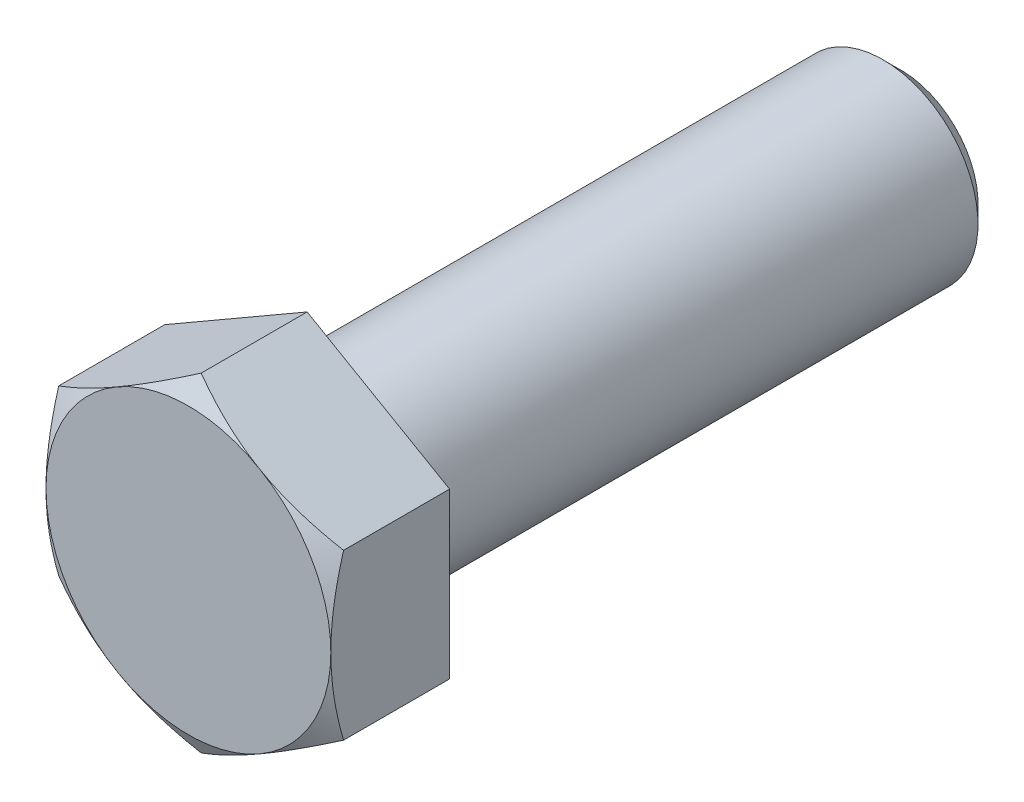
ISO-10303-21;
HEADER;
FILE_DESCRIPTION(('STEP AP214'),'2;1');
FILE_NAME('part.step','',(''),(''),'','','');
FILE_SCHEMA(('AUTOMOTIVE_DESIGN { 1 0 10303 214 1 1 1 1 }'));
ENDSEC;
DATA;
#1=APPLICATION_CONTEXT('core data for automotive mechanical design processes');
#2=APPLICATION_PROTOCOL_DEFINITION('international standard','automotive_design',2000,#1);
#3=PRODUCT_CONTEXT('',#1,'mechanical');
#4=PRODUCT('Part','Part','',(#3));
#5=PRODUCT_RELATED_PRODUCT_CATEGORY('part','',(#4));
#6=PRODUCT_DEFINITION_FORMATION('','',#4);
#7=PRODUCT_DEFINITION_CONTEXT('part definition',#1,'design');
#8=PRODUCT_DEFINITION('design','',#6,#7);
#9=PRODUCT_DEFINITION_SHAPE('','',#8);
#10=(LENGTH_UNIT() NAMED_UNIT(*) SI_UNIT(.MILLI.,.METRE.));
#11=(NAMED_UNIT(*) PLANE_ANGLE_UNIT() SI_UNIT($,.RADIAN.));
#12=(NAMED_UNIT(*) SI_UNIT($,.STERADIAN.) SOLID_ANGLE_UNIT());
#13=UNCERTAINTY_MEASURE_WITH_UNIT(LENGTH_MEASURE(1.E-05),#10,'distance_accuracy_value','');
#14=(GEOMETRIC_REPRESENTATION_CONTEXT(3) GLOBAL_UNCERTAINTY_ASSIGNED_CONTEXT((#13)) GLOBAL_UNIT_ASSIGNED_CONTEXT((#10,
#11,#12)) REPRESENTATION_CONTEXT('',''));
#15=CARTESIAN_POINT('',(0.,0.,0.));
#16=DIRECTION('',(0.,0.,1.));
#17=DIRECTION('',(1.,0.,0.));
#18=AXIS2_PLACEMENT_3D('',#15,#16,#17);
#19=CARTESIAN_POINT('',(-11.9944518424145,-6.925,10.));
#20=DIRECTION('',(1.,0.,0.));
#21=DIRECTION('',(0.,0.,-1.));
#22=AXIS2_PLACEMENT_3D('',#19,#20,#21);
#23=PLANE('',#22);
#24=CARTESIAN_POINT('',(-11.9944518424145,-18.916651266714,3.99304255411589));
#25=CARTESIAN_POINT('',(-11.9944518424145,-18.65332713006,4.12143548843301));
#26=CARTESIAN_POINT('',(-11.9944518424145,-18.389702350382,4.24921154158444));
#27=CARTESIAN_POINT('',(-11.9944518424145,-17.8617888659462,4.50339074864758));
#28=CARTESIAN_POINT('',(-11.9944518424145,-17.5975001549837,4.62979388966999));
#29=CARTESIAN_POINT('',(-11.9944518424145,-16.8034779537679,5.00676659385936));
#30=CARTESIAN_POINT('',(-11.9944518424145,-16.2726616224978,5.2550636391158));
#31=CARTESIAN_POINT('',(-11.9944518424145,-15.2048398758484,5.74542434972928));
#32=CARTESIAN_POINT('',(-11.9944518424145,-14.6678166677863,5.98744935838821));
#33=CARTESIAN_POINT('',(-11.9944518424145,-13.5896076882344,6.4620091280023));
#34=CARTESIAN_POINT('',(-11.9944518424145,-13.0484221060183,6.6945443174863));
#35=CARTESIAN_POINT('',(-11.9944518424145,-11.9425225437582,7.15533366556413));
#36=CARTESIAN_POINT('',(-11.9944518424145,-11.3776347187372,7.38317268715597));
#37=CARTESIAN_POINT('',(-11.9944518424145,-10.2413641664025,7.82235885007694));
#38=CARTESIAN_POINT('',(-11.9944518424145,-9.66998073584953,8.03370418587515));
#39=CARTESIAN_POINT('',(-11.9944518424145,-8.52079847130679,8.43458178671426));
#40=CARTESIAN_POINT('',(-11.9944518424145,-7.94301423875377,8.624155586084));
#41=CARTESIAN_POINT('',(-11.9944518424145,-6.77911094521876,8.97562934069589));
#42=CARTESIAN_POINT('',(-11.9944518424145,-6.19299446892464,9.13753768334616));
#43=CARTESIAN_POINT('',(-11.9944518424145,-5.3090468338312,9.35351366164219));
#44=CARTESIAN_POINT('',(-11.9944518424145,-5.0144451577008,9.4208710848185));
#45=CARTESIAN_POINT('',(-11.9944518424145,-4.42317281629482,9.54584821699384));
#46=CARTESIAN_POINT('',(-11.9944518424145,-4.1265021902937,9.60346811031743));
#47=CARTESIAN_POINT('',(-11.9944518424145,-3.53127483954429,9.70797339971101));
#48=CARTESIAN_POINT('',(-11.9944518424145,-3.23271816525139,9.75485908170252));
#49=CARTESIAN_POINT('',(-11.9944518424145,-2.63400739277033,9.83697403318312));
#50=CARTESIAN_POINT('',(-11.9944518424145,-2.33385336052829,9.872203780146));
#51=CARTESIAN_POINT('',(-11.9944518424145,-1.73642378819876,9.92984690973285));
#52=CARTESIAN_POINT('',(-11.9944518424145,-1.43916451574048,9.95242785114576));
#53=CARTESIAN_POINT('',(-11.9944518424145,-0.843956919887871,9.98498619836202));
#54=CARTESIAN_POINT('',(-11.9944518424145,-0.546008608519027,9.99496382248709));
#55=CARTESIAN_POINT('',(-11.9944518424145,0.0500459123668967,10.0020764577051));
#56=CARTESIAN_POINT('',(-11.9944518424145,0.348152122753596,9.99921139731682));
#57=CARTESIAN_POINT('',(-11.9944518424145,0.943971065504697,9.9807119106433));
#58=CARTESIAN_POINT('',(-11.9944518424145,1.2416837798554,9.96507691875408));
#59=CARTESIAN_POINT('',(-11.9944518424145,1.94772756604726,9.91319318370986));
#60=CARTESIAN_POINT('',(-11.9944518424145,2.35566152514817,9.87141191806672));
#61=CARTESIAN_POINT('',(-11.9944518424145,3.16868715491053,9.76608269309507));
#62=CARTESIAN_POINT('',(-11.9944518424145,3.57377846766142,9.70253204129374));
#63=CARTESIAN_POINT('',(-11.9944518424145,4.78420967870067,9.48258089577494));
#64=CARTESIAN_POINT('',(-11.9944518424145,5.58431237319598,9.29691419933176));
#65=CARTESIAN_POINT('',(-11.9944518424145,6.78136342925836,8.97252727686723));
#66=CARTESIAN_POINT('',(-11.9944518424145,7.18444998983348,8.85513442526049));
#67=CARTESIAN_POINT('',(-11.9944518424145,7.98671422467023,8.60755622042891));
#68=CARTESIAN_POINT('',(-11.9944518424145,8.38589186846454,8.47737076758166));
#69=CARTESIAN_POINT('',(-11.9944518424145,9.180455481968,8.20634387181171));
#70=CARTESIAN_POINT('',(-11.9944518424145,9.57584246701539,8.06550537758822));
#71=CARTESIAN_POINT('',(-11.9944518424145,10.3633011529136,7.77489580880496));
#72=CARTESIAN_POINT('',(-11.9944518424145,10.7553729319294,7.62512494552452));
#73=CARTESIAN_POINT('',(-11.9944518424145,11.4819085933445,7.33958466234801));
#74=CARTESIAN_POINT('',(-11.9944518424145,11.8167566455457,7.204788583371));
#75=CARTESIAN_POINT('',(-11.9944518424145,12.484495230893,6.93042557144577));
#76=CARTESIAN_POINT('',(-11.9944518424145,12.81738573167,6.7908585598661));
#77=CARTESIAN_POINT('',(-11.9944518424145,13.8134888316028,6.36598374947554));
#78=CARTESIAN_POINT('',(-11.9944518424145,14.4740786475998,6.07452379938785));
#79=CARTESIAN_POINT('',(-11.9944518424145,15.7899072378391,5.47916602793452));
#80=CARTESIAN_POINT('',(-11.9944518424145,16.4451437864388,5.17526332056267));
#81=CARTESIAN_POINT('',(-11.9944518424145,17.7511030808341,4.55800113610588));
#82=CARTESIAN_POINT('',(-11.9944518424145,18.4018260159929,4.24464205873949));
#83=CARTESIAN_POINT('',(-11.9944518424145,19.7007256439382,3.61002539205532));
#84=CARTESIAN_POINT('',(-11.9944518424145,20.3488963895518,3.28875566096677));
#85=CARTESIAN_POINT('',(-11.9944518424145,21.642301806296,2.64035475241919));
#86=CARTESIAN_POINT('',(-11.9944518424145,22.2875364519682,2.31322352425692));
#87=CARTESIAN_POINT('',(-11.9944518424145,23.5754524501937,1.65433318539717));
#88=CARTESIAN_POINT('',(-11.9944518424145,24.2181343441847,1.32257513171498));
#89=CARTESIAN_POINT('',(-11.9944518424145,25.5015036164166,0.655232709957774));
#90=CARTESIAN_POINT('',(-11.9944518424145,26.1421910013197,0.319648354681229));
#91=CARTESIAN_POINT('',(-11.9944518424145,27.924670660146,-0.61956303990941));
#92=CARTESIAN_POINT('',(-11.9944518424145,29.0646553909012,-1.22661978018481));
#93=CARTESIAN_POINT('',(-11.9944518424145,31.3408166210456,-2.44798791954628));
#94=CARTESIAN_POINT('',(-11.9944518424145,32.4769928727079,-3.06229977922918));
#95=CARTESIAN_POINT('',(-11.9944518424145,34.7425242539032,-4.29421661781741));
#96=CARTESIAN_POINT('',(-11.9944518424145,35.8718894222397,-4.91180314694921));
#97=CARTESIAN_POINT('',(-11.9944518424145,37.5641951089027,-5.84124373526031));
#98=CARTESIAN_POINT('',(-11.9944518424145,38.1279841260959,-6.15155491387974));
#99=CARTESIAN_POINT('',(-11.9944518424145,39.2550572310404,-6.77309131560383));
#100=CARTESIAN_POINT('',(-11.9944518424145,39.818341319416,-7.08431653757635));
#101=CARTESIAN_POINT('',(-11.9944518424145,40.3814039491518,-7.3959420041286));
#102=B_SPLINE_CURVE_WITH_KNOTS('',3,(#24,#25,#26,#27,#28,#29,#30,#31,#32,#33,#34,#35,#36,#37,
#38,#39,#40,#41,#42,#43,#44,#45,#46,#47,#48,#49,#50,#51,#52,#53,#54,#55,#56,#57,#58,#59,#60,#61,
#62,#63,#64,#65,#66,#67,#68,#69,#70,#71,#72,#73,#74,#75,#76,#77,#78,#79,#80,#81,#82,#83,#84,#85,
#86,#87,#88,#89,#90,#91,#92,#93,#94,#95,#96,#97,#98,#99,#100,#101),.UNSPECIFIED.,.F.,.F.,(4,2,2,
2,2,2,2,2,2,2,2,2,2,2,2,2,2,2,2,2,2,2,2,2,2,2,2,2,2,2,2,2,2,2,2,2,2,2,4),(0.,0.878872284900844,
1.75775281379693,3.51575838735518,5.28281155622525,7.04978484232638,8.87690301414554,
10.7042209172108,12.5279927449866,14.3512106703107,15.2576873767629,16.1641469223283,
17.0705823201985,17.9769805822445,18.8710692294944,19.7651423886278,20.6592205241042,
21.5533382621126,22.7828544489863,24.0125227593446,26.4730415579406,27.7324269934589,
28.9918222372217,30.2508701545089,31.5098883030553,32.5927325496555,33.6755946516103,
35.841494368509,38.0082529021411,40.1749199753296,42.345150167211,44.5153991411365,
46.6851601814142,48.854913966255,52.7295018306159,56.604337012756,60.4659191891692,
62.396555713772,64.3271898480806),.UNSPECIFIED.);
#103=CARTESIAN_POINT('',(-11.9944518424145,6.925,8.92869877172369));
#104=VERTEX_POINT('',#103);
#105=CARTESIAN_POINT('',(-11.9944518424145,0.,10.));
#106=VERTEX_POINT('',#105);
#107=EDGE_CURVE('E104',#104,#106,#102,.F.);
#108=ORIENTED_EDGE('',*,*,#107,.F.);
#109=DIRECTION('',(0.,0.,-1.));
#110=VECTOR('',#109,1.);
#111=CARTESIAN_POINT('',(-11.9944518424145,6.925,10.));
#112=LINE('',#111,#110);
#113=CARTESIAN_POINT('',(-11.9944518424145,6.925,0.));
#114=VERTEX_POINT('',#113);
#115=EDGE_CURVE('E292',#104,#114,#112,.T.);
#116=ORIENTED_EDGE('',*,*,#115,.T.);
#117=DIRECTION('',(0.,-1.,0.));
#118=VECTOR('',#117,1.);
#119=CARTESIAN_POINT('',(-11.9944518424145,-6.925,0.));
#120=LINE('',#119,#118);
#121=CARTESIAN_POINT('',(-11.9944518424145,-6.925,0.));
#122=VERTEX_POINT('',#121);
#123=EDGE_CURVE('E115',#114,#122,#120,.T.);
#124=ORIENTED_EDGE('',*,*,#123,.T.);
#125=DIRECTION('',(0.,0.,-1.));
#126=VECTOR('',#125,1.);
#127=CARTESIAN_POINT('',(-11.9944518424145,-6.925,10.));
#128=LINE('',#127,#126);
#129=CARTESIAN_POINT('',(-11.9944518424145,-6.925,8.92869877172369));
#130=VERTEX_POINT('',#129);
#131=EDGE_CURVE('E129',#130,#122,#128,.T.);
#132=ORIENTED_EDGE('',*,*,#131,.F.);
#133=EDGE_CURVE('E116',#106,#130,#102,.F.);
#134=ORIENTED_EDGE('',*,*,#133,.F.);
#135=EDGE_LOOP('',(#108,#116,#124,#132,#134));
#136=FACE_BOUND('',#135,.T.);
#137=ADVANCED_FACE('F32',(#136),#23,.F.);
#138=CARTESIAN_POINT('',(0.,-13.85,10.));
#139=DIRECTION('',(0.5,0.866025403784439,0.));
#140=DIRECTION('',(-0.866025403784439,0.5,0.));
#141=AXIS2_PLACEMENT_3D('',#138,#139,#140);
#142=PLANE('',#141);
#143=CARTESIAN_POINT('',(-11.9946518424145,-6.92488452994616,8.92863210422331));
#144=CARTESIAN_POINT('',(-11.7309880068237,-7.07711091640009,9.01650526390025));
#145=CARTESIAN_POINT('',(-11.4663410970628,-7.2299048809907,9.1003900980398));
#146=CARTESIAN_POINT('',(-10.934925010333,-7.5367181017159,9.25907647737004));
#147=CARTESIAN_POINT('',(-10.6681551659175,-7.69073774320082,9.33387503508726));
#148=CARTESIAN_POINT('',(-9.86354719447097,-8.15527837210761,9.54319374056304));
#149=CARTESIAN_POINT('',(-9.32253277670568,-8.46763319183987,9.6622529745103));
#150=CARTESIAN_POINT('',(-8.51292950912907,-8.93505785631202,9.80186057760397));
#151=CARTESIAN_POINT('',(-8.24675935675103,-9.08873126543773,9.84162944747569));
#152=CARTESIAN_POINT('',(-7.71318666643687,-9.39678960182284,9.90831903015149));
#153=CARTESIAN_POINT('',(-7.44578410488022,-9.55117454271957,9.93523949565864));
#154=CARTESIAN_POINT('',(-6.91053317187237,-9.86020181297565,9.97554271658337));
#155=CARTESIAN_POINT('',(-6.64268571084418,-10.014843616702,9.98894155919329));
#156=CARTESIAN_POINT('',(-6.10674260481726,-10.324270513237,10.0019160194629));
#157=CARTESIAN_POINT('',(-5.83864696774281,-10.4790556014705,10.0014920642289));
#158=CARTESIAN_POINT('',(-5.33744179757746,-10.7684265413847,9.98778563339743));
#159=CARTESIAN_POINT('',(-5.1042965200804,-10.9030330301079,9.97617504133639));
#160=CARTESIAN_POINT('',(-4.63854219728805,-11.1719364137483,9.94271849124256));
#161=CARTESIAN_POINT('',(-4.40593319109304,-11.3062332860909,9.92087180920881));
#162=CARTESIAN_POINT('',(-3.94137782301578,-11.5744444529038,9.86732395734743));
#163=CARTESIAN_POINT('',(-3.70943216871743,-11.7083583388503,9.83561464821632));
#164=CARTESIAN_POINT('',(-3.2466282748813,-11.9755582915386,9.76289789906763));
#165=CARTESIAN_POINT('',(-3.01577011034418,-12.1088443149788,9.72188982705706));
#166=CARTESIAN_POINT('',(-2.31498719592916,-12.5134415192598,9.58388082194164));
#167=CARTESIAN_POINT('',(-1.84709182423662,-12.783581038059,9.47311881686755));
#168=CARTESIAN_POINT('',(-0.918278067766465,-13.3198319103841,9.22173420899585));
#169=CARTESIAN_POINT('',(-0.457347790585422,-13.5859501299922,9.08117064671575));
#170=CARTESIAN_POINT('',(0.000200000000005751,-13.8501154700538,8.92863210422331));
#171=B_SPLINE_CURVE_WITH_KNOTS('',3,(#143,#144,#145,#146,#147,#148,#149,#150,#151,#152,#153,
#154,#155,#156,#157,#158,#159,#160,#161,#162,#163,#164,#165,#166,#167,#168,#169,#170),
.UNSPECIFIED.,.F.,.F.,(4,2,2,2,2,2,2,2,2,2,2,2,2,4),(0.,0.950565182162974,1.90144205921183,
3.80724359659026,4.73675449755258,5.66628328835706,6.59470487475382,7.52309777417093,
8.33129276431407,9.13954492690339,9.94846589136071,10.7574418508433,12.410969629216,
14.0612516767978),.UNSPECIFIED.);
#172=CARTESIAN_POINT('',(-5.99722592120724,-10.3875,10.));
#173=VERTEX_POINT('',#172);
#174=EDGE_CURVE('E124',#130,#173,#171,.T.);
#175=ORIENTED_EDGE('',*,*,#174,.F.);
#176=ORIENTED_EDGE('',*,*,#131,.T.);
#177=DIRECTION('',(0.866025403784439,-0.5,0.));
#178=VECTOR('',#177,1.);
#179=CARTESIAN_POINT('',(0.,-13.85,0.));
#180=LINE('',#179,#178);
#181=CARTESIAN_POINT('',(0.,-13.85,0.));
#182=VERTEX_POINT('',#181);
#183=EDGE_CURVE('E406',#122,#182,#180,.T.);
#184=ORIENTED_EDGE('',*,*,#183,.T.);
#185=DIRECTION('',(0.,0.,-1.));
#186=VECTOR('',#185,1.);
#187=CARTESIAN_POINT('',(0.,-13.85,10.));
#188=LINE('',#187,#186);
#189=CARTESIAN_POINT('',(0.,-13.85,8.92869877172369));
#190=VERTEX_POINT('',#189);
#191=EDGE_CURVE('E209',#190,#182,#188,.T.);
#192=ORIENTED_EDGE('',*,*,#191,.F.);
#193=EDGE_CURVE('E137',#173,#190,#171,.T.);
#194=ORIENTED_EDGE('',*,*,#193,.F.);
#195=EDGE_LOOP('',(#175,#176,#184,#192,#194));
#196=FACE_BOUND('',#195,.T.);
#197=ADVANCED_FACE('F197',(#196),#142,.F.);
#198=CARTESIAN_POINT('',(11.9944518424145,-6.925,10.));
#199=DIRECTION('',(-0.5,0.866025403784439,0.));
#200=DIRECTION('',(-0.866025403784439,-0.5,0.));
#201=AXIS2_PLACEMENT_3D('',#198,#199,#200);
#202=PLANE('',#201);
#203=CARTESIAN_POINT('',(-0.000200000000005751,-13.8501154700538,8.92863210422331));
#204=CARTESIAN_POINT('',(0.263463835590822,-13.6978890835999,9.01650526390025));
#205=CARTESIAN_POINT('',(0.528110745351635,-13.5450951190093,9.1003900980398));
#206=CARTESIAN_POINT('',(1.05952683208152,-13.2382818982841,9.25907647737004));
#207=CARTESIAN_POINT('',(1.32629667649696,-13.0842622567992,9.33387503508726));
#208=CARTESIAN_POINT('',(2.13090464794351,-12.6197216278924,9.54319374056304));
#209=CARTESIAN_POINT('',(2.67191906570879,-12.3073668081601,9.6622529745103));
#210=CARTESIAN_POINT('',(3.48152233328541,-11.839942143688,9.80186057760397));
#211=CARTESIAN_POINT('',(3.74769248566345,-11.6862687345623,9.84162944747569));
#212=CARTESIAN_POINT('',(4.28126517597761,-11.3782103981772,9.90831903015149));
#213=CARTESIAN_POINT('',(4.54866773753426,-11.2238254572804,9.93523949565864));
#214=CARTESIAN_POINT('',(5.08391867054211,-10.9147981870244,9.97554271658337));
#215=CARTESIAN_POINT('',(5.3517661315703,-10.760156383298,9.98894155919329));
#216=CARTESIAN_POINT('',(5.88770923759721,-10.450729486763,10.0019160194629));
#217=CARTESIAN_POINT('',(6.15580487467166,-10.2959443985295,10.0014920642289));
#218=CARTESIAN_POINT('',(6.65701004483701,-10.0065734586153,9.98778563339743));
#219=CARTESIAN_POINT('',(6.89015532233408,-9.87196696989209,9.97617504133638));
#220=CARTESIAN_POINT('',(7.35590964512643,-9.60306358625169,9.94271849124256));
#221=CARTESIAN_POINT('',(7.58851865132143,-9.46876671390908,9.92087180920881));
#222=CARTESIAN_POINT('',(8.05307401939869,-9.20055554709618,9.86732395734743));
#223=CARTESIAN_POINT('',(8.28501967369704,-9.06664166114967,9.83561464821632));
#224=CARTESIAN_POINT('',(8.74782356753318,-8.79944170846137,9.76289789906763));
#225=CARTESIAN_POINT('',(8.9786817320703,-8.66615568502124,9.72188982705706));
#226=CARTESIAN_POINT('',(9.67946464648532,-8.26155848074023,9.58388082194164));
#227=CARTESIAN_POINT('',(10.1473600181779,-7.99141896194097,9.47311881686755));
#228=CARTESIAN_POINT('',(11.076173774648,-7.4551680896159,9.22173420899585));
#229=CARTESIAN_POINT('',(11.5371040518291,-7.18904987000777,9.08117064671575));
#230=CARTESIAN_POINT('',(11.9946518424145,-6.92488452994616,8.92863210422331));
#231=B_SPLINE_CURVE_WITH_KNOTS('',3,(#203,#204,#205,#206,#207,#208,#209,#210,#211,#212,#213,
#214,#215,#216,#217,#218,#219,#220,#221,#222,#223,#224,#225,#226,#227,#228,#229,#230),
.UNSPECIFIED.,.F.,.F.,(4,2,2,2,2,2,2,2,2,2,2,2,2,4),(0.,0.950565182162974,1.90144205921183,
3.80724359659026,4.73675449755258,5.66628328835706,6.59470487475383,7.52309777417093,
8.33129276431407,9.13954492690339,9.94846589136072,10.7574418508433,12.410969629216,
14.0612516767978),.UNSPECIFIED.);
#232=CARTESIAN_POINT('',(5.99722592120724,-10.3875,10.));
#233=VERTEX_POINT('',#232);
#234=EDGE_CURVE('E192',#190,#233,#231,.T.);
#235=ORIENTED_EDGE('',*,*,#234,.F.);
#236=ORIENTED_EDGE('',*,*,#191,.T.);
#237=DIRECTION('',(0.866025403784438,0.5,0.));
#238=VECTOR('',#237,1.);
#239=CARTESIAN_POINT('',(11.9944518424145,-6.925,0.));
#240=LINE('',#239,#238);
#241=CARTESIAN_POINT('',(11.9944518424145,-6.925,0.));
#242=VERTEX_POINT('',#241);
#243=EDGE_CURVE('E222',#182,#242,#240,.T.);
#244=ORIENTED_EDGE('',*,*,#243,.T.);
#245=DIRECTION('',(0.,0.,-1.));
#246=VECTOR('',#245,1.);
#247=CARTESIAN_POINT('',(11.9944518424145,-6.925,10.));
#248=LINE('',#247,#246);
#249=CARTESIAN_POINT('',(11.9944518424145,-6.925,8.92869877172369));
#250=VERTEX_POINT('',#249);
#251=EDGE_CURVE('E220',#250,#242,#248,.T.);
#252=ORIENTED_EDGE('',*,*,#251,.F.);
#253=EDGE_CURVE('E186',#233,#250,#231,.T.);
#254=ORIENTED_EDGE('',*,*,#253,.F.);
#255=EDGE_LOOP('',(#235,#236,#244,#252,#254));
#256=FACE_BOUND('',#255,.T.);
#257=ADVANCED_FACE('F193',(#256),#202,.F.);
#258=CARTESIAN_POINT('',(11.9944518424145,6.925,10.));
#259=DIRECTION('',(-1.,0.,0.));
#260=DIRECTION('',(0.,-1.,0.));
#261=AXIS2_PLACEMENT_3D('',#258,#259,#260);
#262=PLANE('',#261);
#263=CARTESIAN_POINT('',(11.9944518424145,-18.916651266714,3.99304255411589));
#264=CARTESIAN_POINT('',(11.9944518424145,-18.65332713006,4.12143548843301));
#265=CARTESIAN_POINT('',(11.9944518424145,-18.389702350382,4.24921154158444));
#266=CARTESIAN_POINT('',(11.9944518424145,-17.8617888659462,4.50339074864759));
#267=CARTESIAN_POINT('',(11.9944518424145,-17.5975001549837,4.62979388966999));
#268=CARTESIAN_POINT('',(11.9944518424145,-16.8034779537679,5.00676659385936));
#269=CARTESIAN_POINT('',(11.9944518424145,-16.2726616224978,5.2550636391158));
#270=CARTESIAN_POINT('',(11.9944518424145,-15.2048398758484,5.74542434972928));
#271=CARTESIAN_POINT('',(11.9944518424145,-14.6678166677863,5.98744935838821));
#272=CARTESIAN_POINT('',(11.9944518424145,-13.5896076882344,6.4620091280023));
#273=CARTESIAN_POINT('',(11.9944518424145,-13.0484221060183,6.6945443174863));
#274=CARTESIAN_POINT('',(11.9944518424145,-11.9425225437582,7.15533366556413));
#275=CARTESIAN_POINT('',(11.9944518424145,-11.3776347187372,7.38317268715597));
#276=CARTESIAN_POINT('',(11.9944518424145,-10.2413641664025,7.82235885007694));
#277=CARTESIAN_POINT('',(11.9944518424145,-9.66998073584953,8.03370418587515));
#278=CARTESIAN_POINT('',(11.9944518424145,-8.52079847130679,8.43458178671426));
#279=CARTESIAN_POINT('',(11.9944518424145,-7.94301423875377,8.624155586084));
#280=CARTESIAN_POINT('',(11.9944518424145,-6.77911094521876,8.97562934069589));
#281=CARTESIAN_POINT('',(11.9944518424145,-6.19299446892464,9.13753768334617));
#282=CARTESIAN_POINT('',(11.9944518424145,-5.3090468338312,9.35351366164219));
#283=CARTESIAN_POINT('',(11.9944518424145,-5.0144451577008,9.4208710848185));
#284=CARTESIAN_POINT('',(11.9944518424145,-4.42317281629482,9.54584821699384));
#285=CARTESIAN_POINT('',(11.9944518424145,-4.1265021902937,9.60346811031743));
#286=CARTESIAN_POINT('',(11.9944518424145,-3.53127483954429,9.70797339971101));
#287=CARTESIAN_POINT('',(11.9944518424145,-3.23271816525138,9.75485908170252));
#288=CARTESIAN_POINT('',(11.9944518424145,-2.63400739277033,9.83697403318312));
#289=CARTESIAN_POINT('',(11.9944518424145,-2.33385336052829,9.872203780146));
#290=CARTESIAN_POINT('',(11.9944518424145,-1.73642378819876,9.92984690973285));
#291=CARTESIAN_POINT('',(11.9944518424145,-1.43916451574049,9.95242785114576));
#292=CARTESIAN_POINT('',(11.9944518424145,-0.843956919887873,9.98498619836202));
#293=CARTESIAN_POINT('',(11.9944518424145,-0.546008608519028,9.99496382248709));
#294=CARTESIAN_POINT('',(11.9944518424145,0.0500459123668971,10.0020764577051));
#295=CARTESIAN_POINT('',(11.9944518424145,0.348152122753596,9.99921139731682));
#296=CARTESIAN_POINT('',(11.9944518424145,0.943971065504697,9.9807119106433));
#297=CARTESIAN_POINT('',(11.9944518424145,1.2416837798554,9.96507691875409));
#298=CARTESIAN_POINT('',(11.9944518424145,1.94772756604726,9.91319318370986));
#299=CARTESIAN_POINT('',(11.9944518424145,2.35566152514817,9.87141191806672));
#300=CARTESIAN_POINT('',(11.9944518424145,3.16868715491053,9.76608269309507));
#301=CARTESIAN_POINT('',(11.9944518424145,3.57377846766142,9.70253204129374));
#302=CARTESIAN_POINT('',(11.9944518424145,4.78420967870067,9.48258089577494));
#303=CARTESIAN_POINT('',(11.9944518424145,5.58431237319598,9.29691419933176));
#304=CARTESIAN_POINT('',(11.9944518424145,6.78136342925836,8.97252727686722));
#305=CARTESIAN_POINT('',(11.9944518424145,7.18444998983349,8.85513442526048));
#306=CARTESIAN_POINT('',(11.9944518424145,7.98671422467024,8.60755622042891));
#307=CARTESIAN_POINT('',(11.9944518424145,8.38589186846454,8.47737076758166));
#308=CARTESIAN_POINT('',(11.9944518424145,9.180455481968,8.20634387181171));
#309=CARTESIAN_POINT('',(11.9944518424145,9.5758424670154,8.06550537758822));
#310=CARTESIAN_POINT('',(11.9944518424145,10.3633011529136,7.77489580880496));
#311=CARTESIAN_POINT('',(11.9944518424145,10.7553729319294,7.62512494552452));
#312=CARTESIAN_POINT('',(11.9944518424145,11.4819085933445,7.33958466234801));
#313=CARTESIAN_POINT('',(11.9944518424145,11.8167566455457,7.204788583371));
#314=CARTESIAN_POINT('',(11.9944518424145,12.484495230893,6.93042557144577));
#315=CARTESIAN_POINT('',(11.9944518424145,12.81738573167,6.7908585598661));
#316=CARTESIAN_POINT('',(11.9944518424145,13.8134888316028,6.36598374947554));
#317=CARTESIAN_POINT('',(11.9944518424145,14.4740786475998,6.07452379938785));
#318=CARTESIAN_POINT('',(11.9944518424145,15.7899072378391,5.47916602793452));
#319=CARTESIAN_POINT('',(11.9944518424145,16.4451437864388,5.17526332056267));
#320=CARTESIAN_POINT('',(11.9944518424145,17.7511030808341,4.55800113610588));
#321=CARTESIAN_POINT('',(11.9944518424145,18.4018260159929,4.24464205873949));
#322=CARTESIAN_POINT('',(11.9944518424145,19.7007256439382,3.61002539205532));
#323=CARTESIAN_POINT('',(11.9944518424145,20.3488963895518,3.28875566096677));
#324=CARTESIAN_POINT('',(11.9944518424145,21.642301806296,2.6403547524192));
#325=CARTESIAN_POINT('',(11.9944518424145,22.2875364519682,2.31322352425692));
#326=CARTESIAN_POINT('',(11.9944518424145,23.5754524501937,1.65433318539717));
#327=CARTESIAN_POINT('',(11.9944518424145,24.2181343441847,1.32257513171498));
#328=CARTESIAN_POINT('',(11.9944518424145,25.5015036164166,0.655232709957776));
#329=CARTESIAN_POINT('',(11.9944518424145,26.1421910013197,0.31964835468123));
#330=CARTESIAN_POINT('',(11.9944518424145,27.924670660146,-0.619563039909411));
#331=CARTESIAN_POINT('',(11.9944518424145,29.0646553909012,-1.22661978018481));
#332=CARTESIAN_POINT('',(11.9944518424145,31.3408166210456,-2.44798791954628));
#333=CARTESIAN_POINT('',(11.9944518424145,32.4769928727079,-3.06229977922917));
#334=CARTESIAN_POINT('',(11.9944518424145,34.7425242539032,-4.29421661781741));
#335=CARTESIAN_POINT('',(11.9944518424145,35.8718894222397,-4.91180314694921));
#336=CARTESIAN_POINT('',(11.9944518424145,37.5641951089027,-5.84124373526031));
#337=CARTESIAN_POINT('',(11.9944518424145,38.1279841260959,-6.15155491387974));
#338=CARTESIAN_POINT('',(11.9944518424145,39.2550572310404,-6.77309131560383));
#339=CARTESIAN_POINT('',(11.9944518424145,39.818341319416,-7.08431653757636));
#340=CARTESIAN_POINT('',(11.9944518424145,40.3814039491518,-7.3959420041286));
#341=B_SPLINE_CURVE_WITH_KNOTS('',3,(#263,#264,#265,#266,#267,#268,#269,#270,#271,#272,#273,
#274,#275,#276,#277,#278,#279,#280,#281,#282,#283,#284,#285,#286,#287,#288,#289,#290,#291,#292,
#293,#294,#295,#296,#297,#298,#299,#300,#301,#302,#303,#304,#305,#306,#307,#308,#309,#310,#311,
#312,#313,#314,#315,#316,#317,#318,#319,#320,#321,#322,#323,#324,#325,#326,#327,#328,#329,#330,
#331,#332,#333,#334,#335,#336,#337,#338,#339,#340),.UNSPECIFIED.,.F.,.F.,(4,2,2,2,2,2,2,2,2,2,2,
2,2,2,2,2,2,2,2,2,2,2,2,2,2,2,2,2,2,2,2,2,2,2,2,2,2,2,4),(0.,0.878872284900844,1.75775281379693,
3.51575838735517,5.28281155622524,7.04978484232638,8.87690301414553,10.7042209172107,
12.5279927449866,14.3512106703107,15.2576873767629,16.1641469223283,17.0705823201985,
17.9769805822445,18.8710692294944,19.7651423886278,20.6592205241042,21.5533382621126,
22.7828544489863,24.0125227593446,26.4730415579406,27.7324269934589,28.9918222372217,
30.2508701545089,31.5098883030553,32.5927325496555,33.6755946516103,35.841494368509,
38.0082529021411,40.1749199753296,42.3451501672109,44.5153991411365,46.6851601814141,
48.854913966255,52.7295018306159,56.604337012756,60.4659191891692,62.396555713772,
64.3271898480806),.UNSPECIFIED.);
#342=CARTESIAN_POINT('',(11.9944518424145,0.,10.));
#343=VERTEX_POINT('',#342);
#344=EDGE_CURVE('E55',#250,#343,#341,.T.);
#345=ORIENTED_EDGE('',*,*,#344,.F.);
#346=ORIENTED_EDGE('',*,*,#251,.T.);
#347=DIRECTION('',(0.,1.,0.));
#348=VECTOR('',#347,1.);
#349=CARTESIAN_POINT('',(11.9944518424145,6.925,0.));
#350=LINE('',#349,#348);
#351=CARTESIAN_POINT('',(11.9944518424145,6.925,0.));
#352=VERTEX_POINT('',#351);
#353=EDGE_CURVE('E282',#242,#352,#350,.T.);
#354=ORIENTED_EDGE('',*,*,#353,.T.);
#355=DIRECTION('',(0.,0.,-1.));
#356=VECTOR('',#355,1.);
#357=CARTESIAN_POINT('',(11.9944518424145,6.925,10.));
#358=LINE('',#357,#356);
#359=CARTESIAN_POINT('',(11.9944518424145,6.925,8.92869877172369));
#360=VERTEX_POINT('',#359);
#361=EDGE_CURVE('E226',#360,#352,#358,.T.);
#362=ORIENTED_EDGE('',*,*,#361,.F.);
#363=EDGE_CURVE('E180',#343,#360,#341,.T.);
#364=ORIENTED_EDGE('',*,*,#363,.F.);
#365=EDGE_LOOP('',(#345,#346,#354,#362,#364));
#366=FACE_BOUND('',#365,.T.);
#367=ADVANCED_FACE('F196',(#366),#262,.F.);
#368=CARTESIAN_POINT('',(0.,13.85,10.));
#369=DIRECTION('',(-0.5,-0.866025403784439,0.));
#370=DIRECTION('',(0.866025403784439,-0.5,0.));
#371=AXIS2_PLACEMENT_3D('',#368,#369,#370);
#372=PLANE('',#371);
#373=CARTESIAN_POINT('',(11.9946518424145,6.92488452994616,8.92863210422331));
#374=CARTESIAN_POINT('',(11.7309880068237,7.07711091640009,9.01650526390025));
#375=CARTESIAN_POINT('',(11.4663410970628,7.2299048809907,9.1003900980398));
#376=CARTESIAN_POINT('',(10.934925010333,7.5367181017159,9.25907647737004));
#377=CARTESIAN_POINT('',(10.6681551659175,7.69073774320082,9.33387503508726));
#378=CARTESIAN_POINT('',(9.86354719447097,8.15527837210761,9.54319374056304));
#379=CARTESIAN_POINT('',(9.32253277670568,8.46763319183987,9.6622529745103));
#380=CARTESIAN_POINT('',(8.51292950912907,8.93505785631202,9.80186057760397));
#381=CARTESIAN_POINT('',(8.24675935675103,9.08873126543773,9.84162944747569));
#382=CARTESIAN_POINT('',(7.71318666643687,9.39678960182284,9.90831903015149));
#383=CARTESIAN_POINT('',(7.44578410488022,9.55117454271957,9.93523949565864));
#384=CARTESIAN_POINT('',(6.91053317187237,9.86020181297565,9.97554271658337));
#385=CARTESIAN_POINT('',(6.64268571084418,10.014843616702,9.98894155919329));
#386=CARTESIAN_POINT('',(6.10674260481726,10.324270513237,10.0019160194629));
#387=CARTESIAN_POINT('',(5.83864696774281,10.4790556014705,10.0014920642289));
#388=CARTESIAN_POINT('',(5.33744179757746,10.7684265413847,9.98778563339743));
#389=CARTESIAN_POINT('',(5.1042965200804,10.9030330301079,9.97617504133639));
#390=CARTESIAN_POINT('',(4.63854219728805,11.1719364137483,9.94271849124256));
#391=CARTESIAN_POINT('',(4.40593319109304,11.3062332860909,9.92087180920881));
#392=CARTESIAN_POINT('',(3.94137782301578,11.5744444529038,9.86732395734743));
#393=CARTESIAN_POINT('',(3.70943216871743,11.7083583388503,9.83561464821632));
#394=CARTESIAN_POINT('',(3.2466282748813,11.9755582915386,9.76289789906763));
#395=CARTESIAN_POINT('',(3.01577011034418,12.1088443149788,9.72188982705706));
#396=CARTESIAN_POINT('',(2.31498719592916,12.5134415192598,9.58388082194164));
#397=CARTESIAN_POINT('',(1.84709182423662,12.783581038059,9.47311881686755));
#398=CARTESIAN_POINT('',(0.918278067766465,13.3198319103841,9.22173420899585));
#399=CARTESIAN_POINT('',(0.457347790585422,13.5859501299922,9.08117064671575));
#400=CARTESIAN_POINT('',(-0.000200000000005751,13.8501154700538,8.92863210422331));
#401=B_SPLINE_CURVE_WITH_KNOTS('',3,(#373,#374,#375,#376,#377,#378,#379,#380,#381,#382,#383,
#384,#385,#386,#387,#388,#389,#390,#391,#392,#393,#394,#395,#396,#397,#398,#399,#400),
.UNSPECIFIED.,.F.,.F.,(4,2,2,2,2,2,2,2,2,2,2,2,2,4),(0.,0.950565182162974,1.90144205921183,
3.80724359659026,4.73675449755258,5.66628328835706,6.59470487475382,7.52309777417093,
8.33129276431407,9.13954492690339,9.94846589136071,10.7574418508433,12.410969629216,
14.0612516767978),.UNSPECIFIED.);
#402=CARTESIAN_POINT('',(5.99722592120724,10.3875,10.));
#403=VERTEX_POINT('',#402);
#404=EDGE_CURVE('E47',#360,#403,#401,.T.);
#405=ORIENTED_EDGE('',*,*,#404,.F.);
#406=ORIENTED_EDGE('',*,*,#361,.T.);
#407=DIRECTION('',(-0.866025403784439,0.5,0.));
#408=VECTOR('',#407,1.);
#409=CARTESIAN_POINT('',(0.,13.85,0.));
#410=LINE('',#409,#408);
#411=CARTESIAN_POINT('',(0.,13.85,0.));
#412=VERTEX_POINT('',#411);
#413=EDGE_CURVE('E285',#352,#412,#410,.T.);
#414=ORIENTED_EDGE('',*,*,#413,.T.);
#415=DIRECTION('',(0.,0.,-1.));
#416=VECTOR('',#415,1.);
#417=CARTESIAN_POINT('',(0.,13.85,10.));
#418=LINE('',#417,#416);
#419=CARTESIAN_POINT('',(0.,13.85,8.92869877172369));
#420=VERTEX_POINT('',#419);
#421=EDGE_CURVE('E229',#420,#412,#418,.T.);
#422=ORIENTED_EDGE('',*,*,#421,.F.);
#423=EDGE_CURVE('E172',#403,#420,#401,.T.);
#424=ORIENTED_EDGE('',*,*,#423,.F.);
#425=EDGE_LOOP('',(#405,#406,#414,#422,#424));
#426=FACE_BOUND('',#425,.T.);
#427=ADVANCED_FACE('F270',(#426),#372,.F.);
#428=CARTESIAN_POINT('',(-11.9944518424145,6.925,10.));
#429=DIRECTION('',(0.5,-0.866025403784439,0.));
#430=DIRECTION('',(0.866025403784439,0.5,0.));
#431=AXIS2_PLACEMENT_3D('',#428,#429,#430);
#432=PLANE('',#431);
#433=CARTESIAN_POINT('',(0.000200000000005751,13.8501154700538,8.92863210422331));
#434=CARTESIAN_POINT('',(-0.263463835590822,13.6978890835999,9.01650526390025));
#435=CARTESIAN_POINT('',(-0.528110745351636,13.5450951190093,9.10039009803979));
#436=CARTESIAN_POINT('',(-1.05952683208153,13.2382818982841,9.25907647737004));
#437=CARTESIAN_POINT('',(-1.32629667649696,13.0842622567992,9.33387503508726));
#438=CARTESIAN_POINT('',(-2.13090464794351,12.6197216278924,9.54319374056304));
#439=CARTESIAN_POINT('',(-2.6719190657088,12.3073668081601,9.6622529745103));
#440=CARTESIAN_POINT('',(-3.48152233328541,11.839942143688,9.80186057760397));
#441=CARTESIAN_POINT('',(-3.74769248566345,11.6862687345623,9.84162944747569));
#442=CARTESIAN_POINT('',(-4.28126517597762,11.3782103981772,9.90831903015149));
#443=CARTESIAN_POINT('',(-4.54866773753426,11.2238254572804,9.93523949565864));
#444=CARTESIAN_POINT('',(-5.08391867054212,10.9147981870243,9.97554271658337));
#445=CARTESIAN_POINT('',(-5.35176613157031,10.760156383298,9.98894155919329));
#446=CARTESIAN_POINT('',(-5.88770923759722,10.450729486763,10.0019160194629));
#447=CARTESIAN_POINT('',(-6.15580487467168,10.2959443985295,10.0014920642289));
#448=CARTESIAN_POINT('',(-6.65701004483703,10.0065734586153,9.98778563339743));
#449=CARTESIAN_POINT('',(-6.89015532233409,9.87196696989208,9.97617504133638));
#450=CARTESIAN_POINT('',(-7.35590964512643,9.60306358625169,9.94271849124256));
#451=CARTESIAN_POINT('',(-7.58851865132144,9.46876671390907,9.92087180920881));
#452=CARTESIAN_POINT('',(-8.0530740193987,9.20055554709618,9.86732395734743));
#453=CARTESIAN_POINT('',(-8.28501967369705,9.06664166114967,9.83561464821632));
#454=CARTESIAN_POINT('',(-8.74782356753319,8.79944170846136,9.76289789906763));
#455=CARTESIAN_POINT('',(-8.9786817320703,8.66615568502124,9.72188982705706));
#456=CARTESIAN_POINT('',(-9.67946464648532,8.26155848074023,9.58388082194164));
#457=CARTESIAN_POINT('',(-10.1473600181779,7.99141896194097,9.47311881686755));
#458=CARTESIAN_POINT('',(-11.076173774648,7.4551680896159,9.22173420899585));
#459=CARTESIAN_POINT('',(-11.5371040518291,7.18904987000777,9.08117064671575));
#460=CARTESIAN_POINT('',(-11.9946518424145,6.92488452994616,8.92863210422331));
#461=B_SPLINE_CURVE_WITH_KNOTS('',3,(#433,#434,#435,#436,#437,#438,#439,#440,#441,#442,#443,
#444,#445,#446,#447,#448,#449,#450,#451,#452,#453,#454,#455,#456,#457,#458,#459,#460),
.UNSPECIFIED.,.F.,.F.,(4,2,2,2,2,2,2,2,2,2,2,2,2,4),(0.,0.950565182162975,1.90144205921183,
3.80724359659027,4.73675449755259,5.66628328835707,6.59470487475383,7.52309777417095,
8.33129276431408,9.1395449269034,9.94846589136072,10.7574418508433,12.410969629216,
14.0612516767978),.UNSPECIFIED.);
#462=CARTESIAN_POINT('',(-5.99722592120724,10.3875,10.));
#463=VERTEX_POINT('',#462);
#464=EDGE_CURVE('E297',#420,#463,#461,.T.);
#465=ORIENTED_EDGE('',*,*,#464,.F.);
#466=ORIENTED_EDGE('',*,*,#421,.T.);
#467=DIRECTION('',(-0.866025403784439,-0.5,0.));
#468=VECTOR('',#467,1.);
#469=CARTESIAN_POINT('',(-11.9944518424145,6.925,0.));
#470=LINE('',#469,#468);
#471=EDGE_CURVE('E290',#412,#114,#470,.T.);
#472=ORIENTED_EDGE('',*,*,#471,.T.);
#473=ORIENTED_EDGE('',*,*,#115,.F.);
#474=EDGE_CURVE('E111',#463,#104,#461,.T.);
#475=ORIENTED_EDGE('',*,*,#474,.F.);
#476=EDGE_LOOP('',(#465,#466,#472,#473,#475));
#477=FACE_BOUND('',#476,.T.);
#478=ADVANCED_FACE('F267',(#477),#432,.F.);
#479=CARTESIAN_POINT('',(-11.9944518424145,6.925,0.));
#480=DIRECTION('',(0.,0.,-1.));
#481=DIRECTION('',(-1.,0.,0.));
#482=AXIS2_PLACEMENT_3D('',#479,#480,#481);
#483=PLANE('',#482);
#484=CARTESIAN_POINT('',(0.,0.,0.));
#485=DIRECTION('',(0.,0.,-1.));
#486=DIRECTION('',(-1.,0.,0.));
#487=AXIS2_PLACEMENT_3D('',#484,#485,#486);
#488=CIRCLE('',#487,9.);
#489=CARTESIAN_POINT('',(-9.,0.,0.));
#490=VERTEX_POINT('',#489);
#491=EDGE_CURVE('E11',#490,#490,#488,.F.);
#492=ORIENTED_EDGE('',*,*,#491,.T.);
#493=EDGE_LOOP('',(#492));
#494=FACE_BOUND('',#493,.T.);
#495=ORIENTED_EDGE('',*,*,#123,.F.);
#496=ORIENTED_EDGE('',*,*,#471,.F.);
#497=ORIENTED_EDGE('',*,*,#413,.F.);
#498=ORIENTED_EDGE('',*,*,#353,.F.);
#499=ORIENTED_EDGE('',*,*,#243,.F.);
#500=ORIENTED_EDGE('',*,*,#183,.F.);
#501=EDGE_LOOP('',(#495,#496,#497,#498,#499,#500));
#502=FACE_BOUND('',#501,.T.);
#503=ADVANCED_FACE('F158',(#494,#502),#483,.T.);
#504=CARTESIAN_POINT('',(0.,0.,10.));
#505=DIRECTION('',(0.,0.,-1.));
#506=DIRECTION('',(1.,0.,0.));
#507=AXIS2_PLACEMENT_3D('',#504,#505,#506);
#508=CONICAL_SURFACE('',#507,11.9944518424145,1.0471975511966);
#509=ORIENTED_EDGE('',*,*,#133,.T.);
#510=ORIENTED_EDGE('',*,*,#174,.T.);
#511=CARTESIAN_POINT('',(0.,0.,10.));
#512=DIRECTION('',(0.,0.,-1.));
#513=DIRECTION('',(-1.,0.,0.));
#514=AXIS2_PLACEMENT_3D('',#511,#512,#513);
#515=CIRCLE('',#514,11.9944518424145);
#516=EDGE_CURVE('E121',#173,#106,#515,.T.);
#517=ORIENTED_EDGE('',*,*,#516,.T.);
#518=EDGE_LOOP('',(#509,#510,#517));
#519=FACE_BOUND('',#518,.T.);
#520=ADVANCED_FACE('F122',(#519),#508,.T.);
#521=ORIENTED_EDGE('',*,*,#193,.T.);
#522=ORIENTED_EDGE('',*,*,#234,.T.);
#523=EDGE_CURVE('E128',#233,#173,#515,.T.);
#524=ORIENTED_EDGE('',*,*,#523,.T.);
#525=EDGE_LOOP('',(#521,#522,#524));
#526=FACE_BOUND('',#525,.T.);
#527=ADVANCED_FACE('F212',(#526),#508,.T.);
#528=ORIENTED_EDGE('',*,*,#253,.T.);
#529=ORIENTED_EDGE('',*,*,#344,.T.);
#530=EDGE_CURVE('E215',#343,#233,#515,.T.);
#531=ORIENTED_EDGE('',*,*,#530,.T.);
#532=EDGE_LOOP('',(#528,#529,#531));
#533=FACE_BOUND('',#532,.T.);
#534=ADVANCED_FACE('F216',(#533),#508,.T.);
#535=ORIENTED_EDGE('',*,*,#363,.T.);
#536=ORIENTED_EDGE('',*,*,#404,.T.);
#537=CARTESIAN_POINT('',(0.,0.,10.));
#538=DIRECTION('',(0.,0.,1.));
#539=DIRECTION('',(1.,0.,0.));
#540=AXIS2_PLACEMENT_3D('',#537,#538,#539);
#541=CIRCLE('',#540,11.9944518424145);
#542=EDGE_CURVE('E299',#343,#403,#541,.T.);
#543=ORIENTED_EDGE('',*,*,#542,.F.);
#544=EDGE_LOOP('',(#535,#536,#543));
#545=FACE_BOUND('',#544,.T.);
#546=ADVANCED_FACE('F300',(#545),#508,.T.);
#547=ORIENTED_EDGE('',*,*,#423,.T.);
#548=ORIENTED_EDGE('',*,*,#464,.T.);
#549=EDGE_CURVE('E133',#463,#403,#515,.T.);
#550=ORIENTED_EDGE('',*,*,#549,.T.);
#551=EDGE_LOOP('',(#547,#548,#550));
#552=FACE_BOUND('',#551,.T.);
#553=ADVANCED_FACE('F155',(#552),#508,.T.);
#554=ORIENTED_EDGE('',*,*,#107,.T.);
#555=EDGE_CURVE('E108',#106,#463,#515,.T.);
#556=ORIENTED_EDGE('',*,*,#555,.T.);
#557=ORIENTED_EDGE('',*,*,#474,.T.);
#558=EDGE_LOOP('',(#554,#556,#557));
#559=FACE_BOUND('',#558,.T.);
#560=ADVANCED_FACE('F106',(#559),#508,.T.);
#561=CARTESIAN_POINT('',(-11.9944518424145,6.925,10.));
#562=DIRECTION('',(0.,0.,-1.));
#563=DIRECTION('',(-1.,0.,0.));
#564=AXIS2_PLACEMENT_3D('',#561,#562,#563);
#565=PLANE('',#564);
#566=ORIENTED_EDGE('',*,*,#555,.F.);
#567=ORIENTED_EDGE('',*,*,#516,.F.);
#568=ORIENTED_EDGE('',*,*,#523,.F.);
#569=ORIENTED_EDGE('',*,*,#530,.F.);
#570=ORIENTED_EDGE('',*,*,#542,.T.);
#571=ORIENTED_EDGE('',*,*,#549,.F.);
#572=EDGE_LOOP('',(#566,#567,#568,#569,#570,#571));
#573=FACE_BOUND('',#572,.T.);
#574=ADVANCED_FACE('F131',(#573),#565,.F.);
#575=CARTESIAN_POINT('',(0.,0.,-50.));
#576=DIRECTION('',(0.,0.,1.));
#577=DIRECTION('',(1.,0.,0.));
#578=AXIS2_PLACEMENT_3D('',#575,#576,#577);
#579=CYLINDRICAL_SURFACE('',#578,8.);
#580=CARTESIAN_POINT('',(0.,0.,-1.));
#581=DIRECTION('',(0.,0.,-1.));
#582=DIRECTION('',(-1.,0.,0.));
#583=AXIS2_PLACEMENT_3D('',#580,#581,#582);
#584=CIRCLE('',#583,8.);
#585=CARTESIAN_POINT('',(-8.,0.,-1.));
#586=VERTEX_POINT('',#585);
#587=EDGE_CURVE('E40',#586,#586,#584,.T.);
#588=ORIENTED_EDGE('',*,*,#587,.T.);
#589=EDGE_LOOP('',(#588));
#590=FACE_BOUND('',#589,.T.);
#591=CARTESIAN_POINT('',(0.,0.,-48.5));
#592=DIRECTION('',(0.,0.,-1.));
#593=DIRECTION('',(-1.,0.,0.));
#594=AXIS2_PLACEMENT_3D('',#591,#592,#593);
#595=CIRCLE('',#594,8.);
#596=CARTESIAN_POINT('',(-8.,0.,-48.5));
#597=VERTEX_POINT('',#596);
#598=EDGE_CURVE('E236',#597,#597,#595,.F.);
#599=ORIENTED_EDGE('',*,*,#598,.T.);
#600=EDGE_LOOP('',(#599));
#601=FACE_BOUND('',#600,.T.);
#602=ADVANCED_FACE('F156',(#590,#601),#579,.T.);
#603=CARTESIAN_POINT('',(0.,0.,-50.));
#604=DIRECTION('',(0.,0.,-1.));
#605=DIRECTION('',(-1.,0.,0.));
#606=AXIS2_PLACEMENT_3D('',#603,#604,#605);
#607=PLANE('',#606);
#608=CARTESIAN_POINT('',(0.,0.,-50.));
#609=DIRECTION('',(0.,0.,-1.));
#610=DIRECTION('',(-1.,0.,0.));
#611=AXIS2_PLACEMENT_3D('',#608,#609,#610);
#612=CIRCLE('',#611,6.49999999999997);
#613=CARTESIAN_POINT('',(-6.49999999999997,0.,-50.));
#614=VERTEX_POINT('',#613);
#615=EDGE_CURVE('E134',#614,#614,#612,.T.);
#616=ORIENTED_EDGE('',*,*,#615,.T.);
#617=EDGE_LOOP('',(#616));
#618=FACE_BOUND('',#617,.T.);
#619=ADVANCED_FACE('F251',(#618),#607,.T.);
#620=CARTESIAN_POINT('',(0.,0.,-50.));
#621=DIRECTION('',(0.,0.,1.));
#622=DIRECTION('',(1.,0.,0.));
#623=AXIS2_PLACEMENT_3D('',#620,#621,#622);
#624=CONICAL_SURFACE('',#623,6.49999999999997,0.785398163397454);
#625=ORIENTED_EDGE('',*,*,#598,.F.);
#626=EDGE_LOOP('',(#625));
#627=FACE_BOUND('',#626,.T.);
#628=ORIENTED_EDGE('',*,*,#615,.F.);
#629=EDGE_LOOP('',(#628));
#630=FACE_BOUND('',#629,.T.);
#631=ADVANCED_FACE('F245',(#627,#630),#624,.T.);
#632=CARTESIAN_POINT('',(0.,0.,-1.));
#633=DIRECTION('',(0.,0.,-1.));
#634=DIRECTION('',(-1.,0.,0.));
#635=AXIS2_PLACEMENT_3D('',#632,#633,#634);
#636=TOROIDAL_SURFACE('',#635,9.,1.);
#637=ORIENTED_EDGE('',*,*,#491,.F.);
#638=EDGE_LOOP('',(#637));
#639=FACE_BOUND('',#638,.T.);
#640=ORIENTED_EDGE('',*,*,#587,.F.);
#641=EDGE_LOOP('',(#640));
#642=FACE_BOUND('',#641,.T.);
#643=ADVANCED_FACE('F243',(#639,#642),#636,.F.);
#644=CLOSED_SHELL('',(#137,#197,#257,#367,#427,#478,#503,#520,#527,#534,#546,#553,#560,#574,
#602,#619,#631,#643));
#645=MANIFOLD_SOLID_BREP('B2',#644);
#646=ADVANCED_BREP_SHAPE_REPRESENTATION('',(#18,#645),#14);
#647=SHAPE_DEFINITION_REPRESENTATION(#9,#646);
ENDSEC;
END-ISO-10303-21;
